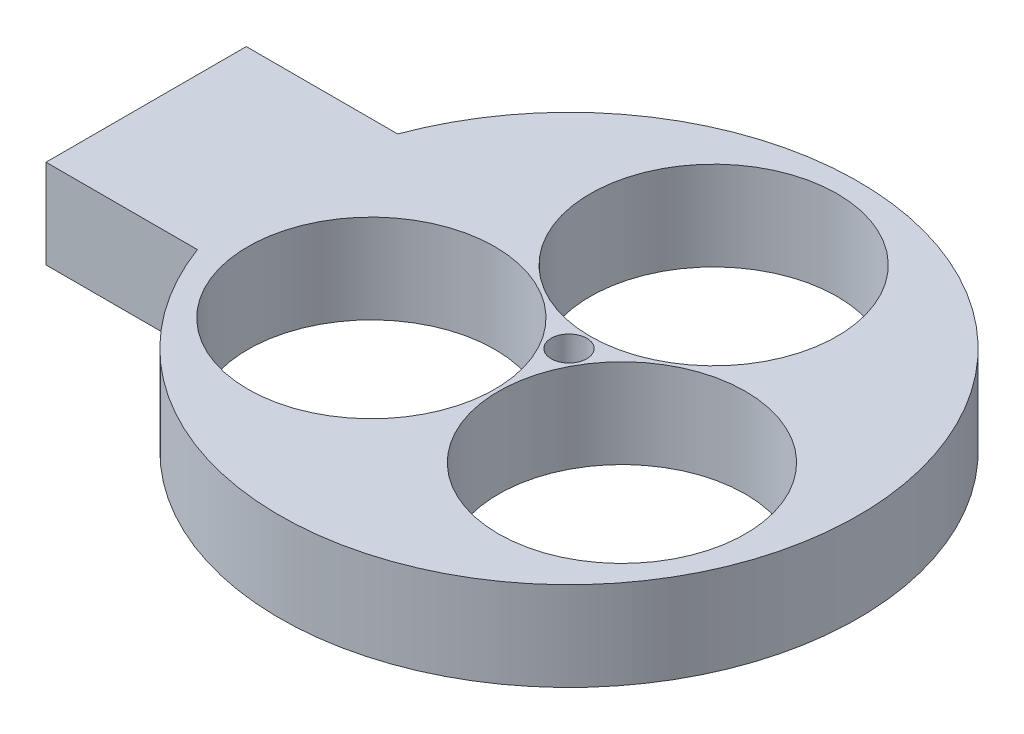
ISO-10303-21;
HEADER;
FILE_DESCRIPTION(('STEP AP214'),'2;1');
FILE_NAME('part.step','',(''),(''),'','','');
FILE_SCHEMA(('AUTOMOTIVE_DESIGN { 1 0 10303 214 1 1 1 1 }'));
ENDSEC;
DATA;
#1=APPLICATION_CONTEXT('core data for automotive mechanical design processes');
#2=APPLICATION_PROTOCOL_DEFINITION('international standard','automotive_design',2000,#1);
#3=PRODUCT_CONTEXT('',#1,'mechanical');
#4=PRODUCT('Part','Part','',(#3));
#5=PRODUCT_RELATED_PRODUCT_CATEGORY('part','',(#4));
#6=PRODUCT_DEFINITION_FORMATION('','',#4);
#7=PRODUCT_DEFINITION_CONTEXT('part definition',#1,'design');
#8=PRODUCT_DEFINITION('design','',#6,#7);
#9=PRODUCT_DEFINITION_SHAPE('','',#8);
#10=(LENGTH_UNIT() NAMED_UNIT(*) SI_UNIT(.MILLI.,.METRE.));
#11=(NAMED_UNIT(*) PLANE_ANGLE_UNIT() SI_UNIT($,.RADIAN.));
#12=(NAMED_UNIT(*) SI_UNIT($,.STERADIAN.) SOLID_ANGLE_UNIT());
#13=UNCERTAINTY_MEASURE_WITH_UNIT(LENGTH_MEASURE(1.E-05),#10,'distance_accuracy_value','');
#14=(GEOMETRIC_REPRESENTATION_CONTEXT(3) GLOBAL_UNCERTAINTY_ASSIGNED_CONTEXT((#13)) GLOBAL_UNIT_ASSIGNED_CONTEXT((#10,
#11,#12)) REPRESENTATION_CONTEXT('',''));
#15=CARTESIAN_POINT('',(0.,0.,0.));
#16=DIRECTION('',(0.,0.,1.));
#17=DIRECTION('',(1.,0.,0.));
#18=AXIS2_PLACEMENT_3D('',#15,#16,#17);
#19=CARTESIAN_POINT('',(0.,2.,0.));
#20=DIRECTION('',(0.,-1.,0.));
#21=DIRECTION('',(0.,0.,-1.));
#22=AXIS2_PLACEMENT_3D('',#19,#20,#21);
#23=CYLINDRICAL_SURFACE('',#22,13.0007230367091);
#24=DIRECTION('',(0.,-1.,0.));
#25=VECTOR('',#24,1.);
#26=CARTESIAN_POINT('',(-12.1970815967271,2.,4.5));
#27=LINE('',#26,#25);
#28=CARTESIAN_POINT('',(-12.1970815967271,-2.,4.5));
#29=VERTEX_POINT('',#28);
#30=CARTESIAN_POINT('',(-12.1970815967271,2.,4.5));
#31=VERTEX_POINT('',#30);
#32=EDGE_CURVE('E11',#29,#31,#27,.F.);
#33=ORIENTED_EDGE('',*,*,#32,.F.);
#34=CARTESIAN_POINT('',(0.,-2.,0.));
#35=DIRECTION('',(0.,1.,0.));
#36=DIRECTION('',(0.,0.,1.));
#37=AXIS2_PLACEMENT_3D('',#34,#35,#36);
#38=CIRCLE('',#37,13.0007230367091);
#39=CARTESIAN_POINT('',(-12.1970815967271,-2.,-4.5));
#40=VERTEX_POINT('',#39);
#41=EDGE_CURVE('E47',#29,#40,#38,.T.);
#42=ORIENTED_EDGE('',*,*,#41,.T.);
#43=DIRECTION('',(0.,-1.,0.));
#44=VECTOR('',#43,1.);
#45=CARTESIAN_POINT('',(-12.1970815967271,2.,-4.5));
#46=LINE('',#45,#44);
#47=CARTESIAN_POINT('',(-12.1970815967271,2.,-4.5));
#48=VERTEX_POINT('',#47);
#49=EDGE_CURVE('E40',#48,#40,#46,.T.);
#50=ORIENTED_EDGE('',*,*,#49,.F.);
#51=CARTESIAN_POINT('',(0.,2.,0.));
#52=DIRECTION('',(0.,1.,0.));
#53=DIRECTION('',(0.,0.,1.));
#54=AXIS2_PLACEMENT_3D('',#51,#52,#53);
#55=CIRCLE('',#54,13.0007230367091);
#56=EDGE_CURVE('E52',#31,#48,#55,.T.);
#57=ORIENTED_EDGE('',*,*,#56,.F.);
#58=EDGE_LOOP('',(#33,#42,#50,#57));
#59=FACE_BOUND('',#58,.T.);
#60=ADVANCED_FACE('F33',(#59),#23,.T.);
#61=CARTESIAN_POINT('',(0.,2.,0.));
#62=DIRECTION('',(0.,1.,0.));
#63=DIRECTION('',(0.,0.,1.));
#64=AXIS2_PLACEMENT_3D('',#61,#62,#63);
#65=PLANE('',#64);
#66=DIRECTION('',(1.,0.,0.));
#67=VECTOR('',#66,1.);
#68=CARTESIAN_POINT('',(-19.0007230367091,2.,4.5));
#69=LINE('',#68,#67);
#70=CARTESIAN_POINT('',(-19.0007230367091,2.,4.5));
#71=VERTEX_POINT('',#70);
#72=EDGE_CURVE('E71',#71,#31,#69,.T.);
#73=ORIENTED_EDGE('',*,*,#72,.T.);
#74=ORIENTED_EDGE('',*,*,#56,.T.);
#75=DIRECTION('',(-1.,0.,0.));
#76=VECTOR('',#75,1.);
#77=CARTESIAN_POINT('',(-11.5007230367091,2.,-4.5));
#78=LINE('',#77,#76);
#79=CARTESIAN_POINT('',(-19.0007230367091,2.,-4.5));
#80=VERTEX_POINT('',#79);
#81=EDGE_CURVE('E79',#48,#80,#78,.T.);
#82=ORIENTED_EDGE('',*,*,#81,.T.);
#83=DIRECTION('',(0.,0.,1.));
#84=VECTOR('',#83,1.);
#85=CARTESIAN_POINT('',(-19.0007230367091,2.,-4.5));
#86=LINE('',#85,#84);
#87=EDGE_CURVE('E80',#80,#71,#86,.T.);
#88=ORIENTED_EDGE('',*,*,#87,.T.);
#89=EDGE_LOOP('',(#73,#74,#82,#88));
#90=FACE_BOUND('',#89,.T.);
#91=CARTESIAN_POINT('',(5.63,2.,3.25));
#92=DIRECTION('',(0.,1.,0.));
#93=DIRECTION('',(0.,0.,1.));
#94=AXIS2_PLACEMENT_3D('',#91,#92,#93);
#95=CIRCLE('',#94,5.55);
#96=CARTESIAN_POINT('',(5.63,2.,8.8));
#97=VERTEX_POINT('',#96);
#98=EDGE_CURVE('E106',#97,#97,#95,.T.);
#99=ORIENTED_EDGE('',*,*,#98,.F.);
#100=EDGE_LOOP('',(#99));
#101=FACE_BOUND('',#100,.T.);
#102=CARTESIAN_POINT('',(0.,2.,-6.5));
#103=DIRECTION('',(0.,1.,0.));
#104=DIRECTION('',(0.,0.,1.));
#105=AXIS2_PLACEMENT_3D('',#102,#103,#104);
#106=CIRCLE('',#105,5.55);
#107=CARTESIAN_POINT('',(0.,2.,-0.95));
#108=VERTEX_POINT('',#107);
#109=EDGE_CURVE('E118',#108,#108,#106,.T.);
#110=ORIENTED_EDGE('',*,*,#109,.F.);
#111=EDGE_LOOP('',(#110));
#112=FACE_BOUND('',#111,.T.);
#113=CARTESIAN_POINT('',(-5.63,2.,3.25));
#114=DIRECTION('',(0.,1.,0.));
#115=DIRECTION('',(0.,0.,1.));
#116=AXIS2_PLACEMENT_3D('',#113,#114,#115);
#117=CIRCLE('',#116,5.55);
#118=CARTESIAN_POINT('',(-5.63,2.,8.8));
#119=VERTEX_POINT('',#118);
#120=EDGE_CURVE('E112',#119,#119,#117,.T.);
#121=ORIENTED_EDGE('',*,*,#120,.F.);
#122=EDGE_LOOP('',(#121));
#123=FACE_BOUND('',#122,.T.);
#124=CARTESIAN_POINT('',(0.,2.,0.));
#125=DIRECTION('',(0.,1.,0.));
#126=DIRECTION('',(0.,0.,1.));
#127=AXIS2_PLACEMENT_3D('',#124,#125,#126);
#128=CIRCLE('',#127,0.8);
#129=CARTESIAN_POINT('',(0.,2.,0.8));
#130=VERTEX_POINT('',#129);
#131=EDGE_CURVE('E98',#130,#130,#128,.T.);
#132=ORIENTED_EDGE('',*,*,#131,.F.);
#133=EDGE_LOOP('',(#132));
#134=FACE_BOUND('',#133,.T.);
#135=ADVANCED_FACE('F83',(#90,#101,#112,#123,#134),#65,.T.);
#136=CARTESIAN_POINT('',(0.,-2.,0.));
#137=DIRECTION('',(0.,1.,0.));
#138=DIRECTION('',(0.,0.,1.));
#139=AXIS2_PLACEMENT_3D('',#136,#137,#138);
#140=PLANE('',#139);
#141=ORIENTED_EDGE('',*,*,#41,.F.);
#142=DIRECTION('',(1.,0.,0.));
#143=VECTOR('',#142,1.);
#144=CARTESIAN_POINT('',(-19.0007230367091,-2.,4.5));
#145=LINE('',#144,#143);
#146=CARTESIAN_POINT('',(-19.0007230367091,-2.,4.5));
#147=VERTEX_POINT('',#146);
#148=EDGE_CURVE('E130',#147,#29,#145,.T.);
#149=ORIENTED_EDGE('',*,*,#148,.F.);
#150=DIRECTION('',(0.,0.,1.));
#151=VECTOR('',#150,1.);
#152=CARTESIAN_POINT('',(-19.0007230367091,-2.,-4.5));
#153=LINE('',#152,#151);
#154=CARTESIAN_POINT('',(-19.0007230367091,-2.,-4.5));
#155=VERTEX_POINT('',#154);
#156=EDGE_CURVE('E93',#155,#147,#153,.T.);
#157=ORIENTED_EDGE('',*,*,#156,.F.);
#158=DIRECTION('',(-1.,0.,0.));
#159=VECTOR('',#158,1.);
#160=CARTESIAN_POINT('',(-11.5007230367091,-2.,-4.5));
#161=LINE('',#160,#159);
#162=EDGE_CURVE('E89',#40,#155,#161,.T.);
#163=ORIENTED_EDGE('',*,*,#162,.F.);
#164=EDGE_LOOP('',(#141,#149,#157,#163));
#165=FACE_BOUND('',#164,.T.);
#166=CARTESIAN_POINT('',(0.,-2.,0.));
#167=DIRECTION('',(0.,1.,0.));
#168=DIRECTION('',(0.,0.,1.));
#169=AXIS2_PLACEMENT_3D('',#166,#167,#168);
#170=CIRCLE('',#169,0.8);
#171=CARTESIAN_POINT('',(0.,-2.,0.8));
#172=VERTEX_POINT('',#171);
#173=EDGE_CURVE('E94',#172,#172,#170,.T.);
#174=ORIENTED_EDGE('',*,*,#173,.T.);
#175=EDGE_LOOP('',(#174));
#176=FACE_BOUND('',#175,.T.);
#177=CARTESIAN_POINT('',(5.63,-2.,3.25));
#178=DIRECTION('',(0.,1.,0.));
#179=DIRECTION('',(0.,0.,1.));
#180=AXIS2_PLACEMENT_3D('',#177,#178,#179);
#181=CIRCLE('',#180,5.55);
#182=CARTESIAN_POINT('',(5.63,-2.,8.8));
#183=VERTEX_POINT('',#182);
#184=EDGE_CURVE('E104',#183,#183,#181,.T.);
#185=ORIENTED_EDGE('',*,*,#184,.T.);
#186=EDGE_LOOP('',(#185));
#187=FACE_BOUND('',#186,.T.);
#188=CARTESIAN_POINT('',(-5.63,-2.,3.25));
#189=DIRECTION('',(0.,1.,0.));
#190=DIRECTION('',(0.,0.,1.));
#191=AXIS2_PLACEMENT_3D('',#188,#189,#190);
#192=CIRCLE('',#191,5.55);
#193=CARTESIAN_POINT('',(-5.63,-2.,8.8));
#194=VERTEX_POINT('',#193);
#195=EDGE_CURVE('E109',#194,#194,#192,.T.);
#196=ORIENTED_EDGE('',*,*,#195,.T.);
#197=EDGE_LOOP('',(#196));
#198=FACE_BOUND('',#197,.T.);
#199=CARTESIAN_POINT('',(0.,-2.,-6.5));
#200=DIRECTION('',(0.,1.,0.));
#201=DIRECTION('',(0.,0.,1.));
#202=AXIS2_PLACEMENT_3D('',#199,#200,#201);
#203=CIRCLE('',#202,5.55);
#204=CARTESIAN_POINT('',(0.,-2.,-0.95));
#205=VERTEX_POINT('',#204);
#206=EDGE_CURVE('E115',#205,#205,#203,.T.);
#207=ORIENTED_EDGE('',*,*,#206,.T.);
#208=EDGE_LOOP('',(#207));
#209=FACE_BOUND('',#208,.T.);
#210=ADVANCED_FACE('F128',(#165,#176,#187,#198,#209),#140,.F.);
#211=CARTESIAN_POINT('',(0.,2.,-6.5));
#212=DIRECTION('',(0.,-1.,0.));
#213=DIRECTION('',(0.,0.,-1.));
#214=AXIS2_PLACEMENT_3D('',#211,#212,#213);
#215=CYLINDRICAL_SURFACE('',#214,5.55);
#216=ORIENTED_EDGE('',*,*,#109,.T.);
#217=EDGE_LOOP('',(#216));
#218=FACE_BOUND('',#217,.T.);
#219=ORIENTED_EDGE('',*,*,#206,.F.);
#220=EDGE_LOOP('',(#219));
#221=FACE_BOUND('',#220,.T.);
#222=ADVANCED_FACE('F142',(#218,#221),#215,.F.);
#223=CARTESIAN_POINT('',(-5.63,2.,3.25));
#224=DIRECTION('',(0.,-1.,0.));
#225=DIRECTION('',(0.,0.,-1.));
#226=AXIS2_PLACEMENT_3D('',#223,#224,#225);
#227=CYLINDRICAL_SURFACE('',#226,5.55);
#228=ORIENTED_EDGE('',*,*,#120,.T.);
#229=EDGE_LOOP('',(#228));
#230=FACE_BOUND('',#229,.T.);
#231=ORIENTED_EDGE('',*,*,#195,.F.);
#232=EDGE_LOOP('',(#231));
#233=FACE_BOUND('',#232,.T.);
#234=ADVANCED_FACE('F146',(#230,#233),#227,.F.);
#235=CARTESIAN_POINT('',(5.63,2.,3.25));
#236=DIRECTION('',(0.,-1.,0.));
#237=DIRECTION('',(0.,0.,-1.));
#238=AXIS2_PLACEMENT_3D('',#235,#236,#237);
#239=CYLINDRICAL_SURFACE('',#238,5.55);
#240=ORIENTED_EDGE('',*,*,#98,.T.);
#241=EDGE_LOOP('',(#240));
#242=FACE_BOUND('',#241,.T.);
#243=ORIENTED_EDGE('',*,*,#184,.F.);
#244=EDGE_LOOP('',(#243));
#245=FACE_BOUND('',#244,.T.);
#246=ADVANCED_FACE('F150',(#242,#245),#239,.F.);
#247=CARTESIAN_POINT('',(0.,2.,0.));
#248=DIRECTION('',(0.,-1.,0.));
#249=DIRECTION('',(0.,0.,-1.));
#250=AXIS2_PLACEMENT_3D('',#247,#248,#249);
#251=CYLINDRICAL_SURFACE('',#250,0.8);
#252=ORIENTED_EDGE('',*,*,#131,.T.);
#253=EDGE_LOOP('',(#252));
#254=FACE_BOUND('',#253,.T.);
#255=ORIENTED_EDGE('',*,*,#173,.F.);
#256=EDGE_LOOP('',(#255));
#257=FACE_BOUND('',#256,.T.);
#258=ADVANCED_FACE('F154',(#254,#257),#251,.F.);
#259=CARTESIAN_POINT('',(-19.0007230367091,2.,4.5));
#260=DIRECTION('',(0.,0.,-1.));
#261=DIRECTION('',(-1.,0.,0.));
#262=AXIS2_PLACEMENT_3D('',#259,#260,#261);
#263=PLANE('',#262);
#264=ORIENTED_EDGE('',*,*,#148,.T.);
#265=ORIENTED_EDGE('',*,*,#32,.T.);
#266=ORIENTED_EDGE('',*,*,#72,.F.);
#267=DIRECTION('',(0.,-1.,0.));
#268=VECTOR('',#267,1.);
#269=CARTESIAN_POINT('',(-19.0007230367091,2.,4.5));
#270=LINE('',#269,#268);
#271=EDGE_CURVE('E76',#71,#147,#270,.T.);
#272=ORIENTED_EDGE('',*,*,#271,.T.);
#273=EDGE_LOOP('',(#264,#265,#266,#272));
#274=FACE_BOUND('',#273,.T.);
#275=ADVANCED_FACE('F74',(#274),#263,.F.);
#276=CARTESIAN_POINT('',(-11.5007230367091,2.,-4.5));
#277=DIRECTION('',(0.,0.,1.));
#278=DIRECTION('',(1.,0.,0.));
#279=AXIS2_PLACEMENT_3D('',#276,#277,#278);
#280=PLANE('',#279);
#281=ORIENTED_EDGE('',*,*,#81,.F.);
#282=ORIENTED_EDGE('',*,*,#49,.T.);
#283=ORIENTED_EDGE('',*,*,#162,.T.);
#284=DIRECTION('',(0.,-1.,0.));
#285=VECTOR('',#284,1.);
#286=CARTESIAN_POINT('',(-19.0007230367091,2.,-4.5));
#287=LINE('',#286,#285);
#288=EDGE_CURVE('E95',#80,#155,#287,.T.);
#289=ORIENTED_EDGE('',*,*,#288,.F.);
#290=EDGE_LOOP('',(#281,#282,#283,#289));
#291=FACE_BOUND('',#290,.T.);
#292=ADVANCED_FACE('F126',(#291),#280,.F.);
#293=CARTESIAN_POINT('',(-19.0007230367091,2.,-4.5));
#294=DIRECTION('',(1.,0.,0.));
#295=DIRECTION('',(0.,0.,-1.));
#296=AXIS2_PLACEMENT_3D('',#293,#294,#295);
#297=PLANE('',#296);
#298=ORIENTED_EDGE('',*,*,#156,.T.);
#299=ORIENTED_EDGE('',*,*,#271,.F.);
#300=ORIENTED_EDGE('',*,*,#87,.F.);
#301=ORIENTED_EDGE('',*,*,#288,.T.);
#302=EDGE_LOOP('',(#298,#299,#300,#301));
#303=FACE_BOUND('',#302,.T.);
#304=ADVANCED_FACE('F91',(#303),#297,.F.);
#305=CLOSED_SHELL('',(#60,#135,#210,#222,#234,#246,#258,#275,#292,#304));
#306=MANIFOLD_SOLID_BREP('B2',#305);
#307=ADVANCED_BREP_SHAPE_REPRESENTATION('',(#18,#306),#14);
#308=SHAPE_DEFINITION_REPRESENTATION(#9,#307);
ENDSEC;
END-ISO-10303-21;
